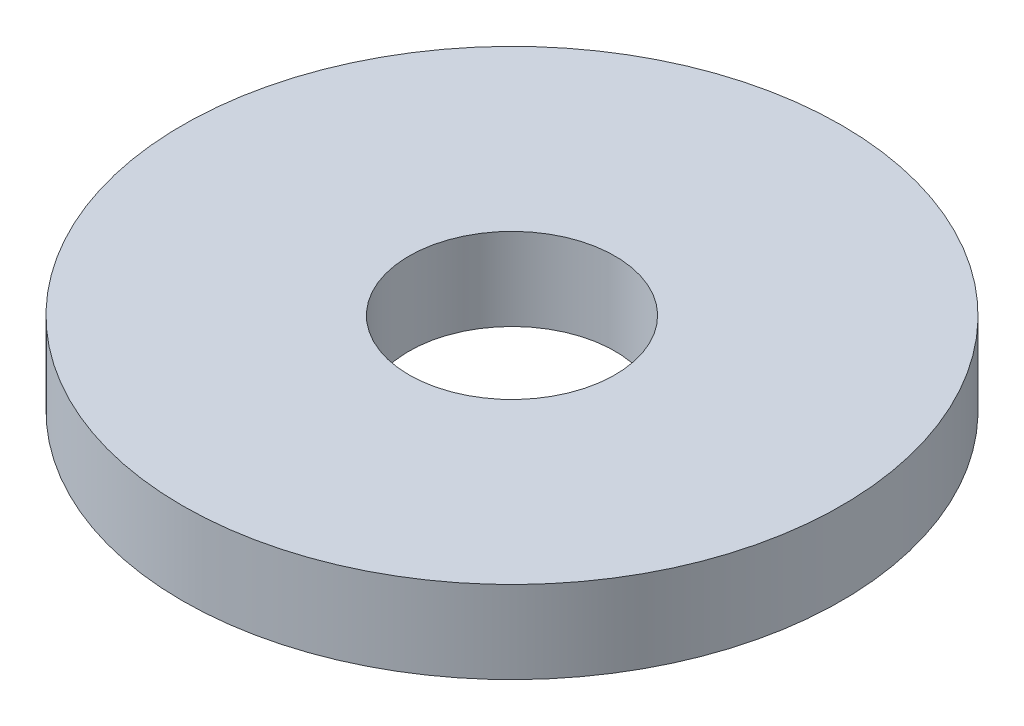
ISO-10303-21;
HEADER;
FILE_DESCRIPTION(('STEP AP214'),'2;1');
FILE_NAME('part.step','',(''),(''),'','','');
FILE_SCHEMA(('AUTOMOTIVE_DESIGN { 1 0 10303 214 1 1 1 1 }'));
ENDSEC;
DATA;
#1=APPLICATION_CONTEXT('core data for automotive mechanical design processes');
#2=APPLICATION_PROTOCOL_DEFINITION('international standard','automotive_design',2000,#1);
#3=PRODUCT_CONTEXT('',#1,'mechanical');
#4=PRODUCT('Part','Part','',(#3));
#5=PRODUCT_RELATED_PRODUCT_CATEGORY('part','',(#4));
#6=PRODUCT_DEFINITION_FORMATION('','',#4);
#7=PRODUCT_DEFINITION_CONTEXT('part definition',#1,'design');
#8=PRODUCT_DEFINITION('design','',#6,#7);
#9=PRODUCT_DEFINITION_SHAPE('','',#8);
#10=(LENGTH_UNIT() NAMED_UNIT(*) SI_UNIT(.MILLI.,.METRE.));
#11=(NAMED_UNIT(*) PLANE_ANGLE_UNIT() SI_UNIT($,.RADIAN.));
#12=(NAMED_UNIT(*) SI_UNIT($,.STERADIAN.) SOLID_ANGLE_UNIT());
#13=UNCERTAINTY_MEASURE_WITH_UNIT(LENGTH_MEASURE(1.E-05),#10,'distance_accuracy_value','');
#14=(GEOMETRIC_REPRESENTATION_CONTEXT(3) GLOBAL_UNCERTAINTY_ASSIGNED_CONTEXT((#13)) GLOBAL_UNIT_ASSIGNED_CONTEXT((#10,
#11,#12)) REPRESENTATION_CONTEXT('',''));
#15=CARTESIAN_POINT('',(0.,0.,0.));
#16=DIRECTION('',(0.,0.,1.));
#17=DIRECTION('',(1.,0.,0.));
#18=AXIS2_PLACEMENT_3D('',#15,#16,#17);
#19=CARTESIAN_POINT('',(0.,10.,0.));
#20=DIRECTION('',(0.,1.,0.));
#21=DIRECTION('',(0.,0.,1.));
#22=AXIS2_PLACEMENT_3D('',#19,#20,#21);
#23=PLANE('',#22);
#24=CARTESIAN_POINT('',(0.,10.,0.));
#25=DIRECTION('',(0.,1.,0.));
#26=DIRECTION('',(0.,0.,1.));
#27=AXIS2_PLACEMENT_3D('',#24,#25,#26);
#28=CIRCLE('',#27,40.);
#29=CARTESIAN_POINT('',(0.,10.,40.));
#30=VERTEX_POINT('',#29);
#31=EDGE_CURVE('E10',#30,#30,#28,.T.);
#32=ORIENTED_EDGE('',*,*,#31,.T.);
#33=EDGE_LOOP('',(#32));
#34=FACE_BOUND('',#33,.T.);
#35=CARTESIAN_POINT('',(0.,10.,0.));
#36=DIRECTION('',(0.,1.,0.));
#37=DIRECTION('',(0.,0.,1.));
#38=AXIS2_PLACEMENT_3D('',#35,#36,#37);
#39=CIRCLE('',#38,12.5);
#40=CARTESIAN_POINT('',(0.,10.,12.5));
#41=VERTEX_POINT('',#40);
#42=EDGE_CURVE('E48',#41,#41,#39,.T.);
#43=ORIENTED_EDGE('',*,*,#42,.F.);
#44=EDGE_LOOP('',(#43));
#45=FACE_BOUND('',#44,.T.);
#46=ADVANCED_FACE('F37',(#34,#45),#23,.T.);
#47=CARTESIAN_POINT('',(0.,0.,0.));
#48=DIRECTION('',(0.,1.,0.));
#49=DIRECTION('',(0.,0.,1.));
#50=AXIS2_PLACEMENT_3D('',#47,#48,#49);
#51=PLANE('',#50);
#52=CARTESIAN_POINT('',(0.,0.,0.));
#53=DIRECTION('',(0.,1.,0.));
#54=DIRECTION('',(0.,0.,1.));
#55=AXIS2_PLACEMENT_3D('',#52,#53,#54);
#56=CIRCLE('',#55,40.);
#57=CARTESIAN_POINT('',(0.,0.,40.));
#58=VERTEX_POINT('',#57);
#59=EDGE_CURVE('E41',#58,#58,#56,.T.);
#60=ORIENTED_EDGE('',*,*,#59,.F.);
#61=EDGE_LOOP('',(#60));
#62=FACE_BOUND('',#61,.T.);
#63=CARTESIAN_POINT('',(0.,0.,0.));
#64=DIRECTION('',(0.,1.,0.));
#65=DIRECTION('',(0.,0.,1.));
#66=AXIS2_PLACEMENT_3D('',#63,#64,#65);
#67=CIRCLE('',#66,12.5);
#68=CARTESIAN_POINT('',(0.,0.,12.5));
#69=VERTEX_POINT('',#68);
#70=EDGE_CURVE('E50',#69,#69,#67,.T.);
#71=ORIENTED_EDGE('',*,*,#70,.T.);
#72=EDGE_LOOP('',(#71));
#73=FACE_BOUND('',#72,.T.);
#74=ADVANCED_FACE('F60',(#62,#73),#51,.F.);
#75=CARTESIAN_POINT('',(0.,10.,0.));
#76=DIRECTION('',(0.,-1.,0.));
#77=DIRECTION('',(0.,0.,-1.));
#78=AXIS2_PLACEMENT_3D('',#75,#76,#77);
#79=CYLINDRICAL_SURFACE('',#78,40.);
#80=ORIENTED_EDGE('',*,*,#31,.F.);
#81=EDGE_LOOP('',(#80));
#82=FACE_BOUND('',#81,.T.);
#83=ORIENTED_EDGE('',*,*,#59,.T.);
#84=EDGE_LOOP('',(#83));
#85=FACE_BOUND('',#84,.T.);
#86=ADVANCED_FACE('F39',(#82,#85),#79,.T.);
#87=CARTESIAN_POINT('',(0.,10.,0.));
#88=DIRECTION('',(0.,-1.,0.));
#89=DIRECTION('',(0.,0.,-1.));
#90=AXIS2_PLACEMENT_3D('',#87,#88,#89);
#91=CYLINDRICAL_SURFACE('',#90,12.5);
#92=ORIENTED_EDGE('',*,*,#42,.T.);
#93=EDGE_LOOP('',(#92));
#94=FACE_BOUND('',#93,.T.);
#95=ORIENTED_EDGE('',*,*,#70,.F.);
#96=EDGE_LOOP('',(#95));
#97=FACE_BOUND('',#96,.T.);
#98=ADVANCED_FACE('F56',(#94,#97),#91,.F.);
#99=CLOSED_SHELL('',(#46,#74,#86,#98));
#100=MANIFOLD_SOLID_BREP('B2',#99);
#101=ADVANCED_BREP_SHAPE_REPRESENTATION('',(#18,#100),#14);
#102=SHAPE_DEFINITION_REPRESENTATION(#9,#101);
ENDSEC;
END-ISO-10303-21;
